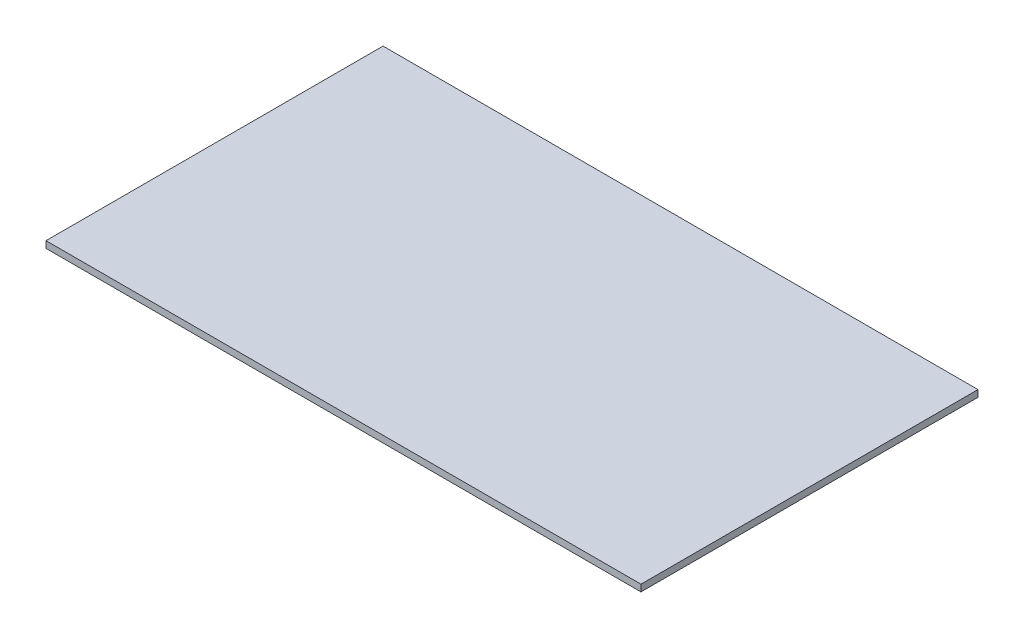
ISO-10303-21;
HEADER;
FILE_DESCRIPTION(('STEP AP214'),'2;1');
FILE_NAME('part.step','',(''),(''),'','','');
FILE_SCHEMA(('AUTOMOTIVE_DESIGN { 1 0 10303 214 1 1 1 1 }'));
ENDSEC;
DATA;
#1=APPLICATION_CONTEXT('core data for automotive mechanical design processes');
#2=APPLICATION_PROTOCOL_DEFINITION('international standard','automotive_design',2000,#1);
#3=PRODUCT_CONTEXT('',#1,'mechanical');
#4=PRODUCT('Part','Part','',(#3));
#5=PRODUCT_RELATED_PRODUCT_CATEGORY('part','',(#4));
#6=PRODUCT_DEFINITION_FORMATION('','',#4);
#7=PRODUCT_DEFINITION_CONTEXT('part definition',#1,'design');
#8=PRODUCT_DEFINITION('design','',#6,#7);
#9=PRODUCT_DEFINITION_SHAPE('','',#8);
#10=(LENGTH_UNIT() NAMED_UNIT(*) SI_UNIT(.MILLI.,.METRE.));
#11=(NAMED_UNIT(*) PLANE_ANGLE_UNIT() SI_UNIT($,.RADIAN.));
#12=(NAMED_UNIT(*) SI_UNIT($,.STERADIAN.) SOLID_ANGLE_UNIT());
#13=UNCERTAINTY_MEASURE_WITH_UNIT(LENGTH_MEASURE(1.E-05),#10,'distance_accuracy_value','');
#14=(GEOMETRIC_REPRESENTATION_CONTEXT(3) GLOBAL_UNCERTAINTY_ASSIGNED_CONTEXT((#13)) GLOBAL_UNIT_ASSIGNED_CONTEXT((#10,
#11,#12)) REPRESENTATION_CONTEXT('',''));
#15=CARTESIAN_POINT('',(0.,0.,0.));
#16=DIRECTION('',(0.,0.,1.));
#17=DIRECTION('',(1.,0.,0.));
#18=AXIS2_PLACEMENT_3D('',#15,#16,#17);
#19=CARTESIAN_POINT('',(44.29,1.,25.09));
#20=DIRECTION('',(-1.,0.,0.));
#21=DIRECTION('',(0.,0.,1.));
#22=AXIS2_PLACEMENT_3D('',#19,#20,#21);
#23=PLANE('',#22);
#24=DIRECTION('',(0.,0.,-1.));
#25=VECTOR('',#24,1.);
#26=CARTESIAN_POINT('',(44.29,0.,25.09));
#27=LINE('',#26,#25);
#28=CARTESIAN_POINT('',(44.29,0.,25.09));
#29=VERTEX_POINT('',#28);
#30=CARTESIAN_POINT('',(44.29,0.,-25.09));
#31=VERTEX_POINT('',#30);
#32=EDGE_CURVE('E96',#29,#31,#27,.T.);
#33=ORIENTED_EDGE('',*,*,#32,.T.);
#34=DIRECTION('',(0.,-1.,0.));
#35=VECTOR('',#34,1.);
#36=CARTESIAN_POINT('',(44.29,1.,-25.09));
#37=LINE('',#36,#35);
#38=CARTESIAN_POINT('',(44.29,1.,-25.09));
#39=VERTEX_POINT('',#38);
#40=EDGE_CURVE('E11',#39,#31,#37,.T.);
#41=ORIENTED_EDGE('',*,*,#40,.F.);
#42=DIRECTION('',(0.,0.,-1.));
#43=VECTOR('',#42,1.);
#44=CARTESIAN_POINT('',(44.29,1.,25.09));
#45=LINE('',#44,#43);
#46=CARTESIAN_POINT('',(44.29,1.,25.09));
#47=VERTEX_POINT('',#46);
#48=EDGE_CURVE('E84',#47,#39,#45,.T.);
#49=ORIENTED_EDGE('',*,*,#48,.F.);
#50=DIRECTION('',(0.,-1.,0.));
#51=VECTOR('',#50,1.);
#52=CARTESIAN_POINT('',(44.29,1.,25.09));
#53=LINE('',#52,#51);
#54=EDGE_CURVE('E92',#47,#29,#53,.T.);
#55=ORIENTED_EDGE('',*,*,#54,.T.);
#56=EDGE_LOOP('',(#33,#41,#49,#55));
#57=FACE_BOUND('',#56,.T.);
#58=ADVANCED_FACE('F33',(#57),#23,.F.);
#59=CARTESIAN_POINT('',(-44.29,1.,-25.09));
#60=DIRECTION('',(0.,0.,1.));
#61=DIRECTION('',(1.,0.,0.));
#62=AXIS2_PLACEMENT_3D('',#59,#60,#61);
#63=PLANE('',#62);
#64=DIRECTION('',(-1.,0.,0.));
#65=VECTOR('',#64,1.);
#66=CARTESIAN_POINT('',(-44.29,0.,-25.09));
#67=LINE('',#66,#65);
#68=CARTESIAN_POINT('',(-44.29,0.,-25.09));
#69=VERTEX_POINT('',#68);
#70=EDGE_CURVE('E88',#31,#69,#67,.T.);
#71=ORIENTED_EDGE('',*,*,#70,.T.);
#72=DIRECTION('',(0.,-1.,0.));
#73=VECTOR('',#72,1.);
#74=CARTESIAN_POINT('',(-44.29,1.,-25.09));
#75=LINE('',#74,#73);
#76=CARTESIAN_POINT('',(-44.29,1.,-25.09));
#77=VERTEX_POINT('',#76);
#78=EDGE_CURVE('E41',#77,#69,#75,.T.);
#79=ORIENTED_EDGE('',*,*,#78,.F.);
#80=DIRECTION('',(-1.,0.,0.));
#81=VECTOR('',#80,1.);
#82=CARTESIAN_POINT('',(-44.29,1.,-25.09));
#83=LINE('',#82,#81);
#84=EDGE_CURVE('E79',#39,#77,#83,.T.);
#85=ORIENTED_EDGE('',*,*,#84,.F.);
#86=ORIENTED_EDGE('',*,*,#40,.T.);
#87=EDGE_LOOP('',(#71,#79,#85,#86));
#88=FACE_BOUND('',#87,.T.);
#89=ADVANCED_FACE('F87',(#88),#63,.F.);
#90=CARTESIAN_POINT('',(-44.29,1.,25.09));
#91=DIRECTION('',(1.,0.,0.));
#92=DIRECTION('',(0.,0.,-1.));
#93=AXIS2_PLACEMENT_3D('',#90,#91,#92);
#94=PLANE('',#93);
#95=DIRECTION('',(0.,0.,1.));
#96=VECTOR('',#95,1.);
#97=CARTESIAN_POINT('',(-44.29,0.,25.09));
#98=LINE('',#97,#96);
#99=CARTESIAN_POINT('',(-44.29,0.,25.09));
#100=VERTEX_POINT('',#99);
#101=EDGE_CURVE('E66',#69,#100,#98,.T.);
#102=ORIENTED_EDGE('',*,*,#101,.T.);
#103=DIRECTION('',(0.,-1.,0.));
#104=VECTOR('',#103,1.);
#105=CARTESIAN_POINT('',(-44.29,1.,25.09));
#106=LINE('',#105,#104);
#107=CARTESIAN_POINT('',(-44.29,1.,25.09));
#108=VERTEX_POINT('',#107);
#109=EDGE_CURVE('E89',#108,#100,#106,.T.);
#110=ORIENTED_EDGE('',*,*,#109,.F.);
#111=DIRECTION('',(0.,0.,1.));
#112=VECTOR('',#111,1.);
#113=CARTESIAN_POINT('',(-44.29,1.,25.09));
#114=LINE('',#113,#112);
#115=EDGE_CURVE('E82',#77,#108,#114,.T.);
#116=ORIENTED_EDGE('',*,*,#115,.F.);
#117=ORIENTED_EDGE('',*,*,#78,.T.);
#118=EDGE_LOOP('',(#102,#110,#116,#117));
#119=FACE_BOUND('',#118,.T.);
#120=ADVANCED_FACE('F90',(#119),#94,.F.);
#121=CARTESIAN_POINT('',(-44.29,1.,25.09));
#122=DIRECTION('',(0.,0.,-1.));
#123=DIRECTION('',(-1.,0.,0.));
#124=AXIS2_PLACEMENT_3D('',#121,#122,#123);
#125=PLANE('',#124);
#126=DIRECTION('',(1.,0.,0.));
#127=VECTOR('',#126,1.);
#128=CARTESIAN_POINT('',(-44.29,0.,25.09));
#129=LINE('',#128,#127);
#130=EDGE_CURVE('E72',#100,#29,#129,.T.);
#131=ORIENTED_EDGE('',*,*,#130,.T.);
#132=ORIENTED_EDGE('',*,*,#54,.F.);
#133=DIRECTION('',(1.,0.,0.));
#134=VECTOR('',#133,1.);
#135=CARTESIAN_POINT('',(-44.29,1.,25.09));
#136=LINE('',#135,#134);
#137=EDGE_CURVE('E49',#108,#47,#136,.T.);
#138=ORIENTED_EDGE('',*,*,#137,.F.);
#139=ORIENTED_EDGE('',*,*,#109,.T.);
#140=EDGE_LOOP('',(#131,#132,#138,#139));
#141=FACE_BOUND('',#140,.T.);
#142=ADVANCED_FACE('F103',(#141),#125,.F.);
#143=CARTESIAN_POINT('',(0.,1.,0.));
#144=DIRECTION('',(0.,-1.,0.));
#145=DIRECTION('',(0.,0.,-1.));
#146=AXIS2_PLACEMENT_3D('',#143,#144,#145);
#147=PLANE('',#146);
#148=ORIENTED_EDGE('',*,*,#48,.T.);
#149=ORIENTED_EDGE('',*,*,#84,.T.);
#150=ORIENTED_EDGE('',*,*,#115,.T.);
#151=ORIENTED_EDGE('',*,*,#137,.T.);
#152=EDGE_LOOP('',(#148,#149,#150,#151));
#153=FACE_BOUND('',#152,.T.);
#154=ADVANCED_FACE('F80',(#153),#147,.F.);
#155=CARTESIAN_POINT('',(0.,0.,0.));
#156=DIRECTION('',(0.,-1.,0.));
#157=DIRECTION('',(0.,0.,-1.));
#158=AXIS2_PLACEMENT_3D('',#155,#156,#157);
#159=PLANE('',#158);
#160=ORIENTED_EDGE('',*,*,#32,.F.);
#161=ORIENTED_EDGE('',*,*,#130,.F.);
#162=ORIENTED_EDGE('',*,*,#101,.F.);
#163=ORIENTED_EDGE('',*,*,#70,.F.);
#164=EDGE_LOOP('',(#160,#161,#162,#163));
#165=FACE_BOUND('',#164,.T.);
#166=ADVANCED_FACE('F106',(#165),#159,.T.);
#167=CLOSED_SHELL('',(#58,#89,#120,#142,#154,#166));
#168=MANIFOLD_SOLID_BREP('B2',#167);
#169=ADVANCED_BREP_SHAPE_REPRESENTATION('',(#18,#168),#14);
#170=SHAPE_DEFINITION_REPRESENTATION(#9,#169);
ENDSEC;
END-ISO-10303-21;
